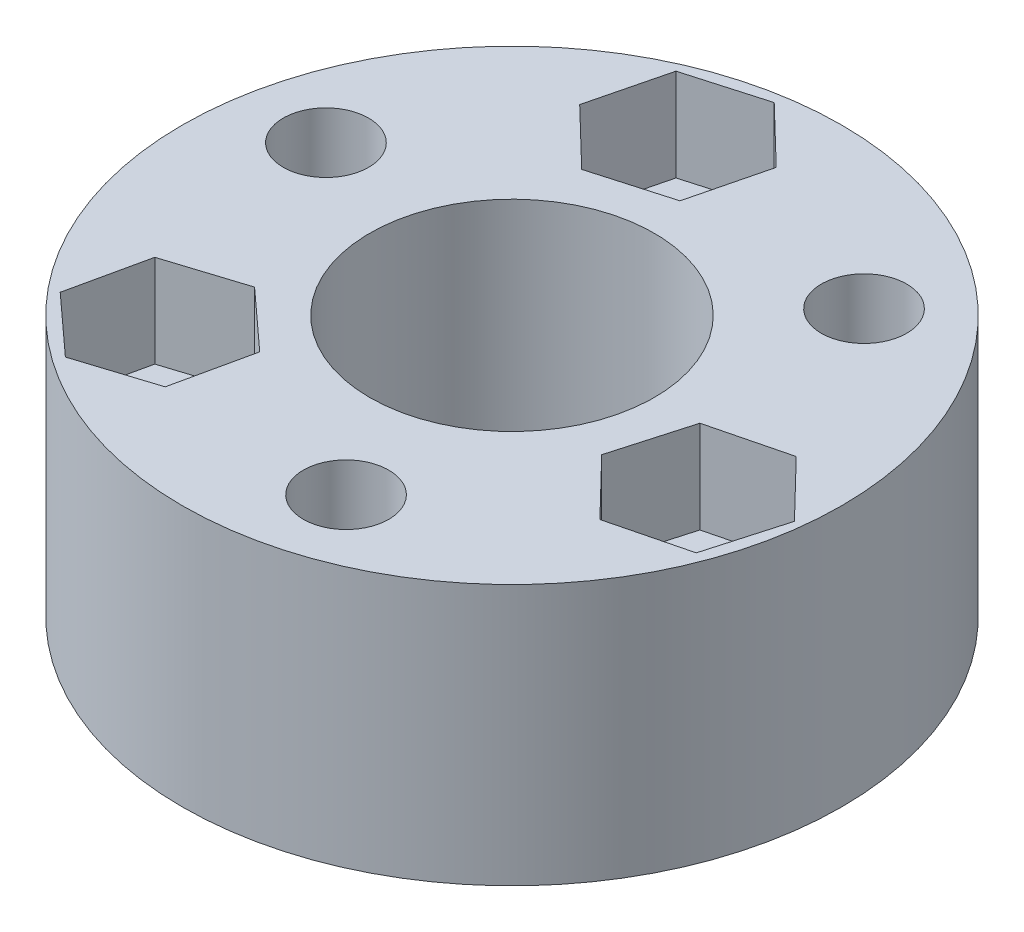
ISO-10303-21;
HEADER;
FILE_DESCRIPTION(('STEP AP214'),'2;1');
FILE_NAME('part.step','',(''),(''),'','','');
FILE_SCHEMA(('AUTOMOTIVE_DESIGN { 1 0 10303 214 1 1 1 1 }'));
ENDSEC;
DATA;
#1=APPLICATION_CONTEXT('core data for automotive mechanical design processes');
#2=APPLICATION_PROTOCOL_DEFINITION('international standard','automotive_design',2000,#1);
#3=PRODUCT_CONTEXT('',#1,'mechanical');
#4=PRODUCT('Part','Part','',(#3));
#5=PRODUCT_RELATED_PRODUCT_CATEGORY('part','',(#4));
#6=PRODUCT_DEFINITION_FORMATION('','',#4);
#7=PRODUCT_DEFINITION_CONTEXT('part definition',#1,'design');
#8=PRODUCT_DEFINITION('design','',#6,#7);
#9=PRODUCT_DEFINITION_SHAPE('','',#8);
#10=(LENGTH_UNIT() NAMED_UNIT(*) SI_UNIT(.MILLI.,.METRE.));
#11=(NAMED_UNIT(*) PLANE_ANGLE_UNIT() SI_UNIT($,.RADIAN.));
#12=(NAMED_UNIT(*) SI_UNIT($,.STERADIAN.) SOLID_ANGLE_UNIT());
#13=UNCERTAINTY_MEASURE_WITH_UNIT(LENGTH_MEASURE(1.E-05),#10,'distance_accuracy_value','');
#14=(GEOMETRIC_REPRESENTATION_CONTEXT(3) GLOBAL_UNCERTAINTY_ASSIGNED_CONTEXT((#13)) GLOBAL_UNIT_ASSIGNED_CONTEXT((#10,
#11,#12)) REPRESENTATION_CONTEXT('',''));
#15=CARTESIAN_POINT('',(0.,0.,0.));
#16=DIRECTION('',(0.,0.,1.));
#17=DIRECTION('',(1.,0.,0.));
#18=AXIS2_PLACEMENT_3D('',#15,#16,#17);
#19=CARTESIAN_POINT('',(-3.05051137175429,11.,-10.0471080600737));
#20=DIRECTION('',(0.,-1.,0.));
#21=DIRECTION('',(0.,0.,-1.));
#22=AXIS2_PLACEMENT_3D('',#19,#20,#21);
#23=CYLINDRICAL_SURFACE('',#22,1.8);
#24=CARTESIAN_POINT('',(-3.05051137175429,0.,-10.0471080600737));
#25=DIRECTION('',(0.,1.,0.));
#26=DIRECTION('',(0.,0.,1.));
#27=AXIS2_PLACEMENT_3D('',#24,#25,#26);
#28=CIRCLE('',#27,1.8);
#29=CARTESIAN_POINT('',(-3.05051137175429,0.,-8.24710806007369));
#30=VERTEX_POINT('',#29);
#31=EDGE_CURVE('E331',#30,#30,#28,.T.);
#32=ORIENTED_EDGE('',*,*,#31,.F.);
#33=EDGE_LOOP('',(#32));
#34=FACE_BOUND('',#33,.T.);
#35=CARTESIAN_POINT('',(-3.05051137175429,7.1,-10.0471080600737));
#36=DIRECTION('',(0.,1.,0.));
#37=DIRECTION('',(0.,0.,1.));
#38=AXIS2_PLACEMENT_3D('',#35,#36,#37);
#39=CIRCLE('',#38,1.8);
#40=CARTESIAN_POINT('',(-3.05051137175429,7.1,-8.24710806007369));
#41=VERTEX_POINT('',#40);
#42=EDGE_CURVE('E37',#41,#41,#39,.T.);
#43=ORIENTED_EDGE('',*,*,#42,.T.);
#44=EDGE_LOOP('',(#43));
#45=FACE_BOUND('',#44,.T.);
#46=ADVANCED_FACE('F33',(#34,#45),#23,.F.);
#47=CARTESIAN_POINT('',(10.2263065004685,11.,2.38173368756413));
#48=DIRECTION('',(0.,-1.,0.));
#49=DIRECTION('',(0.,0.,-1.));
#50=AXIS2_PLACEMENT_3D('',#47,#48,#49);
#51=CYLINDRICAL_SURFACE('',#50,1.8);
#52=CARTESIAN_POINT('',(10.2263065004685,0.,2.38173368756413));
#53=DIRECTION('',(0.,1.,0.));
#54=DIRECTION('',(0.,0.,1.));
#55=AXIS2_PLACEMENT_3D('',#52,#53,#54);
#56=CIRCLE('',#55,1.8);
#57=CARTESIAN_POINT('',(10.2263065004685,0.,4.18173368756413));
#58=VERTEX_POINT('',#57);
#59=EDGE_CURVE('E322',#58,#58,#56,.T.);
#60=ORIENTED_EDGE('',*,*,#59,.F.);
#61=EDGE_LOOP('',(#60));
#62=FACE_BOUND('',#61,.T.);
#63=CARTESIAN_POINT('',(10.2263065004685,7.1,2.38173368756413));
#64=DIRECTION('',(0.,1.,0.));
#65=DIRECTION('',(0.,0.,1.));
#66=AXIS2_PLACEMENT_3D('',#63,#64,#65);
#67=CIRCLE('',#66,1.8);
#68=CARTESIAN_POINT('',(10.2263065004685,7.1,4.18173368756413));
#69=VERTEX_POINT('',#68);
#70=EDGE_CURVE('E345',#69,#69,#67,.T.);
#71=ORIENTED_EDGE('',*,*,#70,.T.);
#72=EDGE_LOOP('',(#71));
#73=FACE_BOUND('',#72,.T.);
#74=ADVANCED_FACE('F362',(#62,#73),#51,.F.);
#75=CARTESIAN_POINT('',(-7.17579512871381,11.,7.66537437250944));
#76=DIRECTION('',(0.,-1.,0.));
#77=DIRECTION('',(0.,0.,-1.));
#78=AXIS2_PLACEMENT_3D('',#75,#76,#77);
#79=CYLINDRICAL_SURFACE('',#78,1.8);
#80=CARTESIAN_POINT('',(-7.17579512871381,0.,7.66537437250944));
#81=DIRECTION('',(0.,1.,0.));
#82=DIRECTION('',(0.,0.,1.));
#83=AXIS2_PLACEMENT_3D('',#80,#81,#82);
#84=CIRCLE('',#83,1.8);
#85=CARTESIAN_POINT('',(-7.17579512871381,0.,9.46537437250944));
#86=VERTEX_POINT('',#85);
#87=EDGE_CURVE('E312',#86,#86,#84,.T.);
#88=ORIENTED_EDGE('',*,*,#87,.F.);
#89=EDGE_LOOP('',(#88));
#90=FACE_BOUND('',#89,.T.);
#91=CARTESIAN_POINT('',(-7.17579512871381,7.1,7.66537437250944));
#92=DIRECTION('',(0.,1.,0.));
#93=DIRECTION('',(0.,0.,1.));
#94=AXIS2_PLACEMENT_3D('',#91,#92,#93);
#95=CIRCLE('',#94,1.8);
#96=CARTESIAN_POINT('',(-7.17579512871381,7.1,9.46537437250944));
#97=VERTEX_POINT('',#96);
#98=EDGE_CURVE('E208',#97,#97,#95,.T.);
#99=ORIENTED_EDGE('',*,*,#98,.T.);
#100=EDGE_LOOP('',(#99));
#101=FACE_BOUND('',#100,.T.);
#102=ADVANCED_FACE('F368',(#90,#101),#79,.F.);
#103=CARTESIAN_POINT('',(0.,11.,0.));
#104=DIRECTION('',(0.,1.,0.));
#105=DIRECTION('',(0.,0.,1.));
#106=AXIS2_PLACEMENT_3D('',#103,#104,#105);
#107=PLANE('',#106);
#108=DIRECTION('',(0.719676550427876,0.,0.694309486298605));
#109=VECTOR('',#108,1.);
#110=CARTESIAN_POINT('',(-6.26897468736533,11.,-9.12253939339754));
#111=LINE('',#110,#109);
#112=CARTESIAN_POINT('',(-6.26897468736533,11.,-9.12253939339754));
#113=VERTEX_POINT('',#112);
#114=CARTESIAN_POINT('',(-3.85904307667516,11.,-6.79755273426816));
#115=VERTEX_POINT('',#114);
#116=EDGE_CURVE('E50',#113,#115,#111,.T.);
#117=ORIENTED_EDGE('',*,*,#116,.F.);
#118=DIRECTION('',(-0.241451378009179,0.,0.970412918327796));
#119=VECTOR('',#118,1.);
#120=CARTESIAN_POINT('',(-5.46044298244446,11.,-12.3720947192031));
#121=LINE('',#120,#119);
#122=CARTESIAN_POINT('',(-5.46044298244446,11.,-12.3720947192031));
#123=VERTEX_POINT('',#122);
#124=EDGE_CURVE('E181',#123,#113,#121,.T.);
#125=ORIENTED_EDGE('',*,*,#124,.F.);
#126=DIRECTION('',(-0.961127928437054,0.,0.27610343202919));
#127=VECTOR('',#126,1.);
#128=CARTESIAN_POINT('',(-2.24197966683342,11.,-13.2966633858792));
#129=LINE('',#128,#127);
#130=CARTESIAN_POINT('',(-2.24197966683342,11.,-13.2966633858792));
#131=VERTEX_POINT('',#130);
#132=EDGE_CURVE('E184',#131,#123,#129,.T.);
#133=ORIENTED_EDGE('',*,*,#132,.F.);
#134=DIRECTION('',(-0.719676550427876,0.,-0.694309486298605));
#135=VECTOR('',#134,1.);
#136=CARTESIAN_POINT('',(0.167951943856751,11.,-10.9716767267498));
#137=LINE('',#136,#135);
#138=CARTESIAN_POINT('',(0.167951943856751,11.,-10.9716767267498));
#139=VERTEX_POINT('',#138);
#140=EDGE_CURVE('E201',#139,#131,#137,.T.);
#141=ORIENTED_EDGE('',*,*,#140,.F.);
#142=DIRECTION('',(0.241451378009178,0.,-0.970412918327796));
#143=VECTOR('',#142,1.);
#144=CARTESIAN_POINT('',(-0.640579761064119,11.,-7.72212140094431));
#145=LINE('',#144,#143);
#146=CARTESIAN_POINT('',(-0.640579761064119,11.,-7.72212140094431));
#147=VERTEX_POINT('',#146);
#148=EDGE_CURVE('E198',#147,#139,#145,.T.);
#149=ORIENTED_EDGE('',*,*,#148,.F.);
#150=DIRECTION('',(0.961127928437054,0.,-0.27610343202919));
#151=VECTOR('',#150,1.);
#152=CARTESIAN_POINT('',(-3.85904307667516,11.,-6.79755273426816));
#153=LINE('',#152,#151);
#154=EDGE_CURVE('E195',#115,#147,#153,.T.);
#155=ORIENTED_EDGE('',*,*,#154,.F.);
#156=EDGE_LOOP('',(#117,#125,#133,#141,#149,#155));
#157=FACE_BOUND('',#156,.T.);
#158=DIRECTION('',(0.969990076691495,0.,-0.243144506662249));
#159=VECTOR('',#158,1.);
#160=CARTESIAN_POINT('',(9.30735587731066,11.,5.6018055944524));
#161=LINE('',#160,#159);
#162=CARTESIAN_POINT('',(9.30735587731066,11.,5.6018055944524));
#163=VERTEX_POINT('',#162);
#164=CARTESIAN_POINT('',(12.5554952622674,11.,4.78760422548652));
#165=VERTEX_POINT('',#164);
#166=EDGE_CURVE('E58',#163,#165,#161,.T.);
#167=ORIENTED_EDGE('',*,*,#166,.F.);
#168=DIRECTION('',(0.69556435790589,0.,0.718463794502526));
#169=VECTOR('',#168,1.);
#170=CARTESIAN_POINT('',(6.97816711551175,11.,3.19593505653001));
#171=LINE('',#170,#169);
#172=CARTESIAN_POINT('',(6.97816711551175,11.,3.19593505653001));
#173=VERTEX_POINT('',#172);
#174=EDGE_CURVE('E220',#173,#163,#171,.T.);
#175=ORIENTED_EDGE('',*,*,#174,.F.);
#176=DIRECTION('',(-0.274425718785605,0.,0.961608301164775));
#177=VECTOR('',#176,1.);
#178=CARTESIAN_POINT('',(7.89711773866962,11.,-0.0241368503582643));
#179=LINE('',#178,#177);
#180=CARTESIAN_POINT('',(7.89711773866962,11.,-0.0241368503582643));
#181=VERTEX_POINT('',#180);
#182=EDGE_CURVE('E247',#181,#173,#179,.T.);
#183=ORIENTED_EDGE('',*,*,#182,.F.);
#184=DIRECTION('',(-0.969990076691495,0.,0.243144506662249));
#185=VECTOR('',#184,1.);
#186=CARTESIAN_POINT('',(11.1452571236264,11.,-0.838338219324149));
#187=LINE('',#186,#185);
#188=CARTESIAN_POINT('',(11.1452571236264,11.,-0.838338219324149));
#189=VERTEX_POINT('',#188);
#190=EDGE_CURVE('E244',#189,#181,#187,.T.);
#191=ORIENTED_EDGE('',*,*,#190,.F.);
#192=DIRECTION('',(-0.69556435790589,0.,-0.718463794502526));
#193=VECTOR('',#192,1.);
#194=CARTESIAN_POINT('',(13.4744458854253,11.,1.56753231859824));
#195=LINE('',#194,#193);
#196=CARTESIAN_POINT('',(13.4744458854253,11.,1.56753231859824));
#197=VERTEX_POINT('',#196);
#198=EDGE_CURVE('E241',#197,#189,#195,.T.);
#199=ORIENTED_EDGE('',*,*,#198,.F.);
#200=DIRECTION('',(0.274425718785604,0.,-0.961608301164775));
#201=VECTOR('',#200,1.);
#202=CARTESIAN_POINT('',(12.5554952622674,11.,4.78760422548652));
#203=LINE('',#202,#201);
#204=EDGE_CURVE('E237',#165,#197,#203,.T.);
#205=ORIENTED_EDGE('',*,*,#204,.F.);
#206=EDGE_LOOP('',(#167,#175,#183,#191,#199,#205));
#207=FACE_BOUND('',#206,.T.);
#208=DIRECTION('',(0.95296035721692,0.,-0.303094964611753));
#209=VECTOR('',#208,1.);
#210=CARTESIAN_POINT('',(-7.8923762957618,11.,10.9364360907235));
#211=LINE('',#210,#209);
#212=CARTESIAN_POINT('',(-7.8923762957618,11.,10.9364360907235));
#213=VERTEX_POINT('',#212);
#214=CARTESIAN_POINT('',(-4.70126316691766,11.,9.92148272615353));
#215=VERTEX_POINT('',#214);
#216=EDGE_CURVE('E282',#213,#215,#211,.T.);
#217=ORIENTED_EDGE('',*,*,#216,.F.);
#218=DIRECTION('',(0.738968117721384,0.,0.673740395843469));
#219=VECTOR('',#218,1.);
#220=CARTESIAN_POINT('',(-10.366908257558,11.,8.68032773707942));
#221=LINE('',#220,#219);
#222=CARTESIAN_POINT('',(-10.366908257558,11.,8.68032773707942));
#223=VERTEX_POINT('',#222);
#224=EDGE_CURVE('E266',#223,#213,#221,.T.);
#225=ORIENTED_EDGE('',*,*,#224,.F.);
#226=DIRECTION('',(-0.213992239495536,0.,0.976835360455223));
#227=VECTOR('',#226,1.);
#228=CARTESIAN_POINT('',(-9.65032709050997,11.,5.40926601886536));
#229=LINE('',#228,#227);
#230=CARTESIAN_POINT('',(-9.65032709050997,11.,5.40926601886536));
#231=VERTEX_POINT('',#230);
#232=EDGE_CURVE('E293',#231,#223,#229,.T.);
#233=ORIENTED_EDGE('',*,*,#232,.F.);
#234=DIRECTION('',(-0.95296035721692,0.,0.303094964611754));
#235=VECTOR('',#234,1.);
#236=CARTESIAN_POINT('',(-6.45921396166583,11.,4.39431265429539));
#237=LINE('',#236,#235);
#238=CARTESIAN_POINT('',(-6.45921396166583,11.,4.39431265429539));
#239=VERTEX_POINT('',#238);
#240=EDGE_CURVE('E290',#239,#231,#237,.T.);
#241=ORIENTED_EDGE('',*,*,#240,.F.);
#242=DIRECTION('',(-0.738968117721384,0.,-0.673740395843469));
#243=VECTOR('',#242,1.);
#244=CARTESIAN_POINT('',(-3.98468199986967,11.,6.65042100793947));
#245=LINE('',#244,#243);
#246=CARTESIAN_POINT('',(-3.98468199986967,11.,6.65042100793947));
#247=VERTEX_POINT('',#246);
#248=EDGE_CURVE('E287',#247,#239,#245,.T.);
#249=ORIENTED_EDGE('',*,*,#248,.F.);
#250=DIRECTION('',(0.213992239495537,0.,-0.976835360455223));
#251=VECTOR('',#250,1.);
#252=CARTESIAN_POINT('',(-4.70126316691766,11.,9.92148272615353));
#253=LINE('',#252,#251);
#254=EDGE_CURVE('E284',#215,#247,#253,.T.);
#255=ORIENTED_EDGE('',*,*,#254,.F.);
#256=EDGE_LOOP('',(#217,#225,#233,#241,#249,#255));
#257=FACE_BOUND('',#256,.T.);
#258=CARTESIAN_POINT('',(0.,11.,0.));
#259=DIRECTION('',(0.,1.,0.));
#260=DIRECTION('',(0.,0.,1.));
#261=AXIS2_PLACEMENT_3D('',#258,#259,#260);
#262=CIRCLE('',#261,13.9);
#263=CARTESIAN_POINT('',(0.,11.,13.9));
#264=VERTEX_POINT('',#263);
#265=EDGE_CURVE('E11',#264,#264,#262,.T.);
#266=ORIENTED_EDGE('',*,*,#265,.T.);
#267=EDGE_LOOP('',(#266));
#268=FACE_BOUND('',#267,.T.);
#269=CARTESIAN_POINT('',(0.,11.,0.));
#270=DIRECTION('',(0.,1.,0.));
#271=DIRECTION('',(0.,0.,1.));
#272=AXIS2_PLACEMENT_3D('',#269,#270,#271);
#273=CIRCLE('',#272,6.);
#274=CARTESIAN_POINT('',(0.,11.,6.));
#275=VERTEX_POINT('',#274);
#276=EDGE_CURVE('E337',#275,#275,#273,.T.);
#277=ORIENTED_EDGE('',*,*,#276,.F.);
#278=EDGE_LOOP('',(#277));
#279=FACE_BOUND('',#278,.T.);
#280=CARTESIAN_POINT('',(7.17579512871409,11.,-7.66537437250952));
#281=DIRECTION('',(0.,1.,0.));
#282=DIRECTION('',(0.,0.,1.));
#283=AXIS2_PLACEMENT_3D('',#280,#281,#282);
#284=CIRCLE('',#283,1.8);
#285=CARTESIAN_POINT('',(7.17579512871409,11.,-5.86537437250953));
#286=VERTEX_POINT('',#285);
#287=EDGE_CURVE('E328',#286,#286,#284,.T.);
#288=ORIENTED_EDGE('',*,*,#287,.F.);
#289=EDGE_LOOP('',(#288));
#290=FACE_BOUND('',#289,.T.);
#291=CARTESIAN_POINT('',(3.05051137175458,11.,10.0471080600736));
#292=DIRECTION('',(0.,1.,0.));
#293=DIRECTION('',(0.,0.,1.));
#294=AXIS2_PLACEMENT_3D('',#291,#292,#293);
#295=CIRCLE('',#294,1.8);
#296=CARTESIAN_POINT('',(3.05051137175458,11.,11.8471080600736));
#297=VERTEX_POINT('',#296);
#298=EDGE_CURVE('E319',#297,#297,#295,.T.);
#299=ORIENTED_EDGE('',*,*,#298,.F.);
#300=EDGE_LOOP('',(#299));
#301=FACE_BOUND('',#300,.T.);
#302=CARTESIAN_POINT('',(-10.2263065004682,11.,-2.3817336875642));
#303=DIRECTION('',(0.,1.,0.));
#304=DIRECTION('',(0.,0.,1.));
#305=AXIS2_PLACEMENT_3D('',#302,#303,#304);
#306=CIRCLE('',#305,1.8);
#307=CARTESIAN_POINT('',(-10.2263065004682,11.,-0.581733687564204));
#308=VERTEX_POINT('',#307);
#309=EDGE_CURVE('E309',#308,#308,#306,.T.);
#310=ORIENTED_EDGE('',*,*,#309,.F.);
#311=EDGE_LOOP('',(#310));
#312=FACE_BOUND('',#311,.T.);
#313=ADVANCED_FACE('F379',(#157,#207,#257,#268,#279,#290,#301,#312),#107,.T.);
#314=CARTESIAN_POINT('',(0.,0.,0.));
#315=DIRECTION('',(0.,1.,0.));
#316=DIRECTION('',(0.,0.,1.));
#317=AXIS2_PLACEMENT_3D('',#314,#315,#316);
#318=PLANE('',#317);
#319=CARTESIAN_POINT('',(0.,0.,0.));
#320=DIRECTION('',(0.,1.,0.));
#321=DIRECTION('',(0.,0.,1.));
#322=AXIS2_PLACEMENT_3D('',#319,#320,#321);
#323=CIRCLE('',#322,13.9);
#324=CARTESIAN_POINT('',(0.,0.,13.9));
#325=VERTEX_POINT('',#324);
#326=EDGE_CURVE('E42',#325,#325,#323,.T.);
#327=ORIENTED_EDGE('',*,*,#326,.F.);
#328=EDGE_LOOP('',(#327));
#329=FACE_BOUND('',#328,.T.);
#330=CARTESIAN_POINT('',(0.,0.,0.));
#331=DIRECTION('',(0.,1.,0.));
#332=DIRECTION('',(0.,0.,1.));
#333=AXIS2_PLACEMENT_3D('',#330,#331,#332);
#334=CIRCLE('',#333,6.);
#335=CARTESIAN_POINT('',(0.,0.,6.));
#336=VERTEX_POINT('',#335);
#337=EDGE_CURVE('E336',#336,#336,#334,.T.);
#338=ORIENTED_EDGE('',*,*,#337,.T.);
#339=EDGE_LOOP('',(#338));
#340=FACE_BOUND('',#339,.T.);
#341=ORIENTED_EDGE('',*,*,#31,.T.);
#342=EDGE_LOOP('',(#341));
#343=FACE_BOUND('',#342,.T.);
#344=CARTESIAN_POINT('',(7.17579512871409,0.,-7.66537437250952));
#345=DIRECTION('',(0.,1.,0.));
#346=DIRECTION('',(0.,0.,1.));
#347=AXIS2_PLACEMENT_3D('',#344,#345,#346);
#348=CIRCLE('',#347,1.8);
#349=CARTESIAN_POINT('',(7.17579512871409,0.,-5.86537437250953));
#350=VERTEX_POINT('',#349);
#351=EDGE_CURVE('E327',#350,#350,#348,.T.);
#352=ORIENTED_EDGE('',*,*,#351,.T.);
#353=EDGE_LOOP('',(#352));
#354=FACE_BOUND('',#353,.T.);
#355=ORIENTED_EDGE('',*,*,#59,.T.);
#356=EDGE_LOOP('',(#355));
#357=FACE_BOUND('',#356,.T.);
#358=CARTESIAN_POINT('',(3.05051137175458,0.,10.0471080600736));
#359=DIRECTION('',(0.,1.,0.));
#360=DIRECTION('',(0.,0.,1.));
#361=AXIS2_PLACEMENT_3D('',#358,#359,#360);
#362=CIRCLE('',#361,1.8);
#363=CARTESIAN_POINT('',(3.05051137175458,0.,11.8471080600736));
#364=VERTEX_POINT('',#363);
#365=EDGE_CURVE('E318',#364,#364,#362,.T.);
#366=ORIENTED_EDGE('',*,*,#365,.T.);
#367=EDGE_LOOP('',(#366));
#368=FACE_BOUND('',#367,.T.);
#369=ORIENTED_EDGE('',*,*,#87,.T.);
#370=EDGE_LOOP('',(#369));
#371=FACE_BOUND('',#370,.T.);
#372=CARTESIAN_POINT('',(-10.2263065004682,0.,-2.3817336875642));
#373=DIRECTION('',(0.,1.,0.));
#374=DIRECTION('',(0.,0.,1.));
#375=AXIS2_PLACEMENT_3D('',#372,#373,#374);
#376=CIRCLE('',#375,1.8);
#377=CARTESIAN_POINT('',(-10.2263065004682,0.,-0.581733687564204));
#378=VERTEX_POINT('',#377);
#379=EDGE_CURVE('E313',#378,#378,#376,.T.);
#380=ORIENTED_EDGE('',*,*,#379,.T.);
#381=EDGE_LOOP('',(#380));
#382=FACE_BOUND('',#381,.T.);
#383=ADVANCED_FACE('F381',(#329,#340,#343,#354,#357,#368,#371,#382),#318,.F.);
#384=CARTESIAN_POINT('',(0.,11.,0.));
#385=DIRECTION('',(0.,-1.,0.));
#386=DIRECTION('',(0.,0.,-1.));
#387=AXIS2_PLACEMENT_3D('',#384,#385,#386);
#388=CYLINDRICAL_SURFACE('',#387,13.9);
#389=ORIENTED_EDGE('',*,*,#265,.F.);
#390=EDGE_LOOP('',(#389));
#391=FACE_BOUND('',#390,.T.);
#392=ORIENTED_EDGE('',*,*,#326,.T.);
#393=EDGE_LOOP('',(#392));
#394=FACE_BOUND('',#393,.T.);
#395=ADVANCED_FACE('F35',(#391,#394),#388,.T.);
#396=CARTESIAN_POINT('',(0.,11.,0.));
#397=DIRECTION('',(0.,-1.,0.));
#398=DIRECTION('',(0.,0.,-1.));
#399=AXIS2_PLACEMENT_3D('',#396,#397,#398);
#400=CYLINDRICAL_SURFACE('',#399,6.);
#401=ORIENTED_EDGE('',*,*,#276,.T.);
#402=EDGE_LOOP('',(#401));
#403=FACE_BOUND('',#402,.T.);
#404=ORIENTED_EDGE('',*,*,#337,.F.);
#405=EDGE_LOOP('',(#404));
#406=FACE_BOUND('',#405,.T.);
#407=ADVANCED_FACE('F375',(#403,#406),#400,.F.);
#408=CARTESIAN_POINT('',(7.17579512871409,11.,-7.66537437250952));
#409=DIRECTION('',(0.,-1.,0.));
#410=DIRECTION('',(0.,0.,-1.));
#411=AXIS2_PLACEMENT_3D('',#408,#409,#410);
#412=CYLINDRICAL_SURFACE('',#411,1.8);
#413=ORIENTED_EDGE('',*,*,#287,.T.);
#414=EDGE_LOOP('',(#413));
#415=FACE_BOUND('',#414,.T.);
#416=ORIENTED_EDGE('',*,*,#351,.F.);
#417=EDGE_LOOP('',(#416));
#418=FACE_BOUND('',#417,.T.);
#419=ADVANCED_FACE('F374',(#415,#418),#412,.F.);
#420=CARTESIAN_POINT('',(3.05051137175458,11.,10.0471080600736));
#421=DIRECTION('',(0.,-1.,0.));
#422=DIRECTION('',(0.,0.,-1.));
#423=AXIS2_PLACEMENT_3D('',#420,#421,#422);
#424=CYLINDRICAL_SURFACE('',#423,1.8);
#425=ORIENTED_EDGE('',*,*,#298,.T.);
#426=EDGE_LOOP('',(#425));
#427=FACE_BOUND('',#426,.T.);
#428=ORIENTED_EDGE('',*,*,#365,.F.);
#429=EDGE_LOOP('',(#428));
#430=FACE_BOUND('',#429,.T.);
#431=ADVANCED_FACE('F407',(#427,#430),#424,.F.);
#432=CARTESIAN_POINT('',(-10.2263065004682,11.,-2.3817336875642));
#433=DIRECTION('',(0.,-1.,0.));
#434=DIRECTION('',(0.,0.,-1.));
#435=AXIS2_PLACEMENT_3D('',#432,#433,#434);
#436=CYLINDRICAL_SURFACE('',#435,1.8);
#437=ORIENTED_EDGE('',*,*,#309,.T.);
#438=EDGE_LOOP('',(#437));
#439=FACE_BOUND('',#438,.T.);
#440=ORIENTED_EDGE('',*,*,#379,.F.);
#441=EDGE_LOOP('',(#440));
#442=FACE_BOUND('',#441,.T.);
#443=ADVANCED_FACE('F404',(#439,#442),#436,.F.);
#444=CARTESIAN_POINT('',(-7.8923762957618,7.1,10.9364360907235));
#445=DIRECTION('',(0.303094964611753,0.,0.95296035721692));
#446=DIRECTION('',(0.95296035721692,0.,-0.303094964611753));
#447=AXIS2_PLACEMENT_3D('',#444,#445,#446);
#448=PLANE('',#447);
#449=ORIENTED_EDGE('',*,*,#216,.T.);
#450=DIRECTION('',(0.,1.,0.));
#451=VECTOR('',#450,1.);
#452=CARTESIAN_POINT('',(-4.70126316691766,7.1,9.92148272615353));
#453=LINE('',#452,#451);
#454=CARTESIAN_POINT('',(-4.70126316691766,7.1,9.92148272615353));
#455=VERTEX_POINT('',#454);
#456=EDGE_CURVE('E281',#455,#215,#453,.T.);
#457=ORIENTED_EDGE('',*,*,#456,.F.);
#458=DIRECTION('',(0.95296035721692,0.,-0.303094964611753));
#459=VECTOR('',#458,1.);
#460=CARTESIAN_POINT('',(-7.8923762957618,7.1,10.9364360907235));
#461=LINE('',#460,#459);
#462=CARTESIAN_POINT('',(-7.8923762957618,7.1,10.9364360907235));
#463=VERTEX_POINT('',#462);
#464=EDGE_CURVE('E262',#463,#455,#461,.T.);
#465=ORIENTED_EDGE('',*,*,#464,.F.);
#466=DIRECTION('',(0.,1.,0.));
#467=VECTOR('',#466,1.);
#468=CARTESIAN_POINT('',(-7.8923762957618,7.1,10.9364360907235));
#469=LINE('',#468,#467);
#470=EDGE_CURVE('E238',#463,#213,#469,.T.);
#471=ORIENTED_EDGE('',*,*,#470,.T.);
#472=EDGE_LOOP('',(#449,#457,#465,#471));
#473=FACE_BOUND('',#472,.T.);
#474=ADVANCED_FACE('F406',(#473),#448,.F.);
#475=CARTESIAN_POINT('',(-10.366908257558,7.1,8.68032773707942));
#476=DIRECTION('',(-0.673740395843469,0.,0.738968117721384));
#477=DIRECTION('',(0.738968117721384,0.,0.673740395843469));
#478=AXIS2_PLACEMENT_3D('',#475,#476,#477);
#479=PLANE('',#478);
#480=ORIENTED_EDGE('',*,*,#224,.T.);
#481=ORIENTED_EDGE('',*,*,#470,.F.);
#482=DIRECTION('',(0.738968117721384,0.,0.673740395843469));
#483=VECTOR('',#482,1.);
#484=CARTESIAN_POINT('',(-10.366908257558,7.1,8.68032773707942));
#485=LINE('',#484,#483);
#486=CARTESIAN_POINT('',(-10.366908257558,7.1,8.68032773707942));
#487=VERTEX_POINT('',#486);
#488=EDGE_CURVE('E278',#487,#463,#485,.T.);
#489=ORIENTED_EDGE('',*,*,#488,.F.);
#490=DIRECTION('',(0.,1.,0.));
#491=VECTOR('',#490,1.);
#492=CARTESIAN_POINT('',(-10.366908257558,7.1,8.68032773707942));
#493=LINE('',#492,#491);
#494=EDGE_CURVE('E299',#487,#223,#493,.T.);
#495=ORIENTED_EDGE('',*,*,#494,.T.);
#496=EDGE_LOOP('',(#480,#481,#489,#495));
#497=FACE_BOUND('',#496,.T.);
#498=ADVANCED_FACE('F414',(#497),#479,.F.);
#499=CARTESIAN_POINT('',(-9.65032709050997,7.1,5.40926601886536));
#500=DIRECTION('',(-0.976835360455223,0.,-0.213992239495536));
#501=DIRECTION('',(-0.213992239495536,0.,0.976835360455223));
#502=AXIS2_PLACEMENT_3D('',#499,#500,#501);
#503=PLANE('',#502);
#504=ORIENTED_EDGE('',*,*,#232,.T.);
#505=ORIENTED_EDGE('',*,*,#494,.F.);
#506=DIRECTION('',(-0.213992239495536,0.,0.976835360455223));
#507=VECTOR('',#506,1.);
#508=CARTESIAN_POINT('',(-9.65032709050997,7.1,5.40926601886536));
#509=LINE('',#508,#507);
#510=CARTESIAN_POINT('',(-9.65032709050997,7.1,5.40926601886536));
#511=VERTEX_POINT('',#510);
#512=EDGE_CURVE('E275',#511,#487,#509,.T.);
#513=ORIENTED_EDGE('',*,*,#512,.F.);
#514=DIRECTION('',(0.,1.,0.));
#515=VECTOR('',#514,1.);
#516=CARTESIAN_POINT('',(-9.65032709050997,7.1,5.40926601886536));
#517=LINE('',#516,#515);
#518=EDGE_CURVE('E301',#511,#231,#517,.T.);
#519=ORIENTED_EDGE('',*,*,#518,.T.);
#520=EDGE_LOOP('',(#504,#505,#513,#519));
#521=FACE_BOUND('',#520,.T.);
#522=ADVANCED_FACE('F451',(#521),#503,.F.);
#523=CARTESIAN_POINT('',(-6.45921396166583,7.1,4.39431265429539));
#524=DIRECTION('',(-0.303094964611754,0.,-0.95296035721692));
#525=DIRECTION('',(-0.95296035721692,0.,0.303094964611754));
#526=AXIS2_PLACEMENT_3D('',#523,#524,#525);
#527=PLANE('',#526);
#528=ORIENTED_EDGE('',*,*,#240,.T.);
#529=ORIENTED_EDGE('',*,*,#518,.F.);
#530=DIRECTION('',(-0.95296035721692,0.,0.303094964611754));
#531=VECTOR('',#530,1.);
#532=CARTESIAN_POINT('',(-6.45921396166583,7.1,4.39431265429539));
#533=LINE('',#532,#531);
#534=CARTESIAN_POINT('',(-6.45921396166583,7.1,4.39431265429539));
#535=VERTEX_POINT('',#534);
#536=EDGE_CURVE('E272',#535,#511,#533,.T.);
#537=ORIENTED_EDGE('',*,*,#536,.F.);
#538=DIRECTION('',(0.,1.,0.));
#539=VECTOR('',#538,1.);
#540=CARTESIAN_POINT('',(-6.45921396166583,7.1,4.39431265429539));
#541=LINE('',#540,#539);
#542=EDGE_CURVE('E303',#535,#239,#541,.T.);
#543=ORIENTED_EDGE('',*,*,#542,.T.);
#544=EDGE_LOOP('',(#528,#529,#537,#543));
#545=FACE_BOUND('',#544,.T.);
#546=ADVANCED_FACE('F447',(#545),#527,.F.);
#547=CARTESIAN_POINT('',(-3.98468199986967,7.1,6.65042100793947));
#548=DIRECTION('',(0.673740395843469,0.,-0.738968117721384));
#549=DIRECTION('',(-0.738968117721384,0.,-0.673740395843469));
#550=AXIS2_PLACEMENT_3D('',#547,#548,#549);
#551=PLANE('',#550);
#552=ORIENTED_EDGE('',*,*,#248,.T.);
#553=ORIENTED_EDGE('',*,*,#542,.F.);
#554=DIRECTION('',(-0.738968117721384,0.,-0.673740395843469));
#555=VECTOR('',#554,1.);
#556=CARTESIAN_POINT('',(-3.98468199986967,7.1,6.65042100793947));
#557=LINE('',#556,#555);
#558=CARTESIAN_POINT('',(-3.98468199986967,7.1,6.65042100793947));
#559=VERTEX_POINT('',#558);
#560=EDGE_CURVE('E269',#559,#535,#557,.T.);
#561=ORIENTED_EDGE('',*,*,#560,.F.);
#562=DIRECTION('',(0.,1.,0.));
#563=VECTOR('',#562,1.);
#564=CARTESIAN_POINT('',(-3.98468199986967,7.1,6.65042100793947));
#565=LINE('',#564,#563);
#566=EDGE_CURVE('E305',#559,#247,#565,.T.);
#567=ORIENTED_EDGE('',*,*,#566,.T.);
#568=EDGE_LOOP('',(#552,#553,#561,#567));
#569=FACE_BOUND('',#568,.T.);
#570=ADVANCED_FACE('F443',(#569),#551,.F.);
#571=CARTESIAN_POINT('',(-4.70126316691766,7.1,9.92148272615353));
#572=DIRECTION('',(0.976835360455223,0.,0.213992239495537));
#573=DIRECTION('',(0.213992239495537,0.,-0.976835360455223));
#574=AXIS2_PLACEMENT_3D('',#571,#572,#573);
#575=PLANE('',#574);
#576=ORIENTED_EDGE('',*,*,#254,.T.);
#577=ORIENTED_EDGE('',*,*,#566,.F.);
#578=DIRECTION('',(0.213992239495537,0.,-0.976835360455223));
#579=VECTOR('',#578,1.);
#580=CARTESIAN_POINT('',(-4.70126316691766,7.1,9.92148272615353));
#581=LINE('',#580,#579);
#582=EDGE_CURVE('E265',#455,#559,#581,.T.);
#583=ORIENTED_EDGE('',*,*,#582,.F.);
#584=ORIENTED_EDGE('',*,*,#456,.T.);
#585=EDGE_LOOP('',(#576,#577,#583,#584));
#586=FACE_BOUND('',#585,.T.);
#587=ADVANCED_FACE('F432',(#586),#575,.F.);
#588=CARTESIAN_POINT('',(0.,7.1,0.));
#589=DIRECTION('',(0.,1.,0.));
#590=DIRECTION('',(0.,0.,1.));
#591=AXIS2_PLACEMENT_3D('',#588,#589,#590);
#592=PLANE('',#591);
#593=ORIENTED_EDGE('',*,*,#98,.F.);
#594=EDGE_LOOP('',(#593));
#595=FACE_BOUND('',#594,.T.);
#596=ORIENTED_EDGE('',*,*,#464,.T.);
#597=ORIENTED_EDGE('',*,*,#582,.T.);
#598=ORIENTED_EDGE('',*,*,#560,.T.);
#599=ORIENTED_EDGE('',*,*,#536,.T.);
#600=ORIENTED_EDGE('',*,*,#512,.T.);
#601=ORIENTED_EDGE('',*,*,#488,.T.);
#602=EDGE_LOOP('',(#596,#597,#598,#599,#600,#601));
#603=FACE_BOUND('',#602,.T.);
#604=ADVANCED_FACE('F428',(#595,#603),#592,.T.);
#605=CARTESIAN_POINT('',(9.30735587731066,7.1,5.6018055944524));
#606=DIRECTION('',(0.243144506662249,0.,0.969990076691495));
#607=DIRECTION('',(0.969990076691495,0.,-0.243144506662249));
#608=AXIS2_PLACEMENT_3D('',#605,#606,#607);
#609=PLANE('',#608);
#610=ORIENTED_EDGE('',*,*,#166,.T.);
#611=DIRECTION('',(0.,1.,0.));
#612=VECTOR('',#611,1.);
#613=CARTESIAN_POINT('',(12.5554952622674,7.1,4.78760422548652));
#614=LINE('',#613,#612);
#615=CARTESIAN_POINT('',(12.5554952622674,7.1,4.78760422548652));
#616=VERTEX_POINT('',#615);
#617=EDGE_CURVE('E235',#616,#165,#614,.T.);
#618=ORIENTED_EDGE('',*,*,#617,.F.);
#619=DIRECTION('',(0.969990076691495,0.,-0.243144506662249));
#620=VECTOR('',#619,1.);
#621=CARTESIAN_POINT('',(9.30735587731066,7.1,5.6018055944524));
#622=LINE('',#621,#620);
#623=CARTESIAN_POINT('',(9.30735587731066,7.1,5.6018055944524));
#624=VERTEX_POINT('',#623);
#625=EDGE_CURVE('E216',#624,#616,#622,.T.);
#626=ORIENTED_EDGE('',*,*,#625,.F.);
#627=DIRECTION('',(0.,1.,0.));
#628=VECTOR('',#627,1.);
#629=CARTESIAN_POINT('',(9.30735587731066,7.1,5.6018055944524));
#630=LINE('',#629,#628);
#631=EDGE_CURVE('E196',#624,#163,#630,.T.);
#632=ORIENTED_EDGE('',*,*,#631,.T.);
#633=EDGE_LOOP('',(#610,#618,#626,#632));
#634=FACE_BOUND('',#633,.T.);
#635=ADVANCED_FACE('F431',(#634),#609,.F.);
#636=CARTESIAN_POINT('',(6.97816711551175,7.1,3.19593505653001));
#637=DIRECTION('',(-0.718463794502526,0.,0.69556435790589));
#638=DIRECTION('',(0.69556435790589,0.,0.718463794502526));
#639=AXIS2_PLACEMENT_3D('',#636,#637,#638);
#640=PLANE('',#639);
#641=ORIENTED_EDGE('',*,*,#174,.T.);
#642=ORIENTED_EDGE('',*,*,#631,.F.);
#643=DIRECTION('',(0.69556435790589,0.,0.718463794502526));
#644=VECTOR('',#643,1.);
#645=CARTESIAN_POINT('',(6.97816711551175,7.1,3.19593505653001));
#646=LINE('',#645,#644);
#647=CARTESIAN_POINT('',(6.97816711551175,7.1,3.19593505653001));
#648=VERTEX_POINT('',#647);
#649=EDGE_CURVE('E232',#648,#624,#646,.T.);
#650=ORIENTED_EDGE('',*,*,#649,.F.);
#651=DIRECTION('',(0.,1.,0.));
#652=VECTOR('',#651,1.);
#653=CARTESIAN_POINT('',(6.97816711551175,7.1,3.19593505653001));
#654=LINE('',#653,#652);
#655=EDGE_CURVE('E253',#648,#173,#654,.T.);
#656=ORIENTED_EDGE('',*,*,#655,.T.);
#657=EDGE_LOOP('',(#641,#642,#650,#656));
#658=FACE_BOUND('',#657,.T.);
#659=ADVANCED_FACE('F562',(#658),#640,.F.);
#660=CARTESIAN_POINT('',(7.89711773866962,7.1,-0.0241368503582643));
#661=DIRECTION('',(-0.961608301164775,0.,-0.274425718785605));
#662=DIRECTION('',(-0.274425718785605,0.,0.961608301164775));
#663=AXIS2_PLACEMENT_3D('',#660,#661,#662);
#664=PLANE('',#663);
#665=ORIENTED_EDGE('',*,*,#182,.T.);
#666=ORIENTED_EDGE('',*,*,#655,.F.);
#667=DIRECTION('',(-0.274425718785605,0.,0.961608301164775));
#668=VECTOR('',#667,1.);
#669=CARTESIAN_POINT('',(7.89711773866962,7.1,-0.0241368503582643));
#670=LINE('',#669,#668);
#671=CARTESIAN_POINT('',(7.89711773866962,7.1,-0.0241368503582643));
#672=VERTEX_POINT('',#671);
#673=EDGE_CURVE('E229',#672,#648,#670,.T.);
#674=ORIENTED_EDGE('',*,*,#673,.F.);
#675=DIRECTION('',(0.,1.,0.));
#676=VECTOR('',#675,1.);
#677=CARTESIAN_POINT('',(7.89711773866962,7.1,-0.0241368503582643));
#678=LINE('',#677,#676);
#679=EDGE_CURVE('E255',#672,#181,#678,.T.);
#680=ORIENTED_EDGE('',*,*,#679,.T.);
#681=EDGE_LOOP('',(#665,#666,#674,#680));
#682=FACE_BOUND('',#681,.T.);
#683=ADVANCED_FACE('F571',(#682),#664,.F.);
#684=CARTESIAN_POINT('',(11.1452571236264,7.1,-0.838338219324149));
#685=DIRECTION('',(-0.243144506662249,0.,-0.969990076691495));
#686=DIRECTION('',(-0.969990076691495,0.,0.243144506662249));
#687=AXIS2_PLACEMENT_3D('',#684,#685,#686);
#688=PLANE('',#687);
#689=ORIENTED_EDGE('',*,*,#190,.T.);
#690=ORIENTED_EDGE('',*,*,#679,.F.);
#691=DIRECTION('',(-0.969990076691495,0.,0.243144506662249));
#692=VECTOR('',#691,1.);
#693=CARTESIAN_POINT('',(11.1452571236264,7.1,-0.838338219324149));
#694=LINE('',#693,#692);
#695=CARTESIAN_POINT('',(11.1452571236264,7.1,-0.838338219324149));
#696=VERTEX_POINT('',#695);
#697=EDGE_CURVE('E226',#696,#672,#694,.T.);
#698=ORIENTED_EDGE('',*,*,#697,.F.);
#699=DIRECTION('',(0.,1.,0.));
#700=VECTOR('',#699,1.);
#701=CARTESIAN_POINT('',(11.1452571236264,7.1,-0.838338219324149));
#702=LINE('',#701,#700);
#703=EDGE_CURVE('E257',#696,#189,#702,.T.);
#704=ORIENTED_EDGE('',*,*,#703,.T.);
#705=EDGE_LOOP('',(#689,#690,#698,#704));
#706=FACE_BOUND('',#705,.T.);
#707=ADVANCED_FACE('F581',(#706),#688,.F.);
#708=CARTESIAN_POINT('',(13.4744458854253,7.1,1.56753231859824));
#709=DIRECTION('',(0.718463794502526,0.,-0.69556435790589));
#710=DIRECTION('',(-0.69556435790589,0.,-0.718463794502526));
#711=AXIS2_PLACEMENT_3D('',#708,#709,#710);
#712=PLANE('',#711);
#713=ORIENTED_EDGE('',*,*,#198,.T.);
#714=ORIENTED_EDGE('',*,*,#703,.F.);
#715=DIRECTION('',(-0.69556435790589,0.,-0.718463794502526));
#716=VECTOR('',#715,1.);
#717=CARTESIAN_POINT('',(13.4744458854253,7.1,1.56753231859824));
#718=LINE('',#717,#716);
#719=CARTESIAN_POINT('',(13.4744458854253,7.1,1.56753231859824));
#720=VERTEX_POINT('',#719);
#721=EDGE_CURVE('E223',#720,#696,#718,.T.);
#722=ORIENTED_EDGE('',*,*,#721,.F.);
#723=DIRECTION('',(0.,1.,0.));
#724=VECTOR('',#723,1.);
#725=CARTESIAN_POINT('',(13.4744458854253,7.1,1.56753231859824));
#726=LINE('',#725,#724);
#727=EDGE_CURVE('E259',#720,#197,#726,.T.);
#728=ORIENTED_EDGE('',*,*,#727,.T.);
#729=EDGE_LOOP('',(#713,#714,#722,#728));
#730=FACE_BOUND('',#729,.T.);
#731=ADVANCED_FACE('F591',(#730),#712,.F.);
#732=CARTESIAN_POINT('',(12.5554952622674,7.1,4.78760422548652));
#733=DIRECTION('',(0.961608301164775,0.,0.274425718785604));
#734=DIRECTION('',(0.274425718785604,0.,-0.961608301164775));
#735=AXIS2_PLACEMENT_3D('',#732,#733,#734);
#736=PLANE('',#735);
#737=ORIENTED_EDGE('',*,*,#204,.T.);
#738=ORIENTED_EDGE('',*,*,#727,.F.);
#739=DIRECTION('',(0.274425718785604,0.,-0.961608301164775));
#740=VECTOR('',#739,1.);
#741=CARTESIAN_POINT('',(12.5554952622674,7.1,4.78760422548652));
#742=LINE('',#741,#740);
#743=EDGE_CURVE('E219',#616,#720,#742,.T.);
#744=ORIENTED_EDGE('',*,*,#743,.F.);
#745=ORIENTED_EDGE('',*,*,#617,.T.);
#746=EDGE_LOOP('',(#737,#738,#744,#745));
#747=FACE_BOUND('',#746,.T.);
#748=ADVANCED_FACE('F601',(#747),#736,.F.);
#749=CARTESIAN_POINT('',(0.,7.1,0.));
#750=DIRECTION('',(0.,1.,0.));
#751=DIRECTION('',(0.,0.,1.));
#752=AXIS2_PLACEMENT_3D('',#749,#750,#751);
#753=PLANE('',#752);
#754=ORIENTED_EDGE('',*,*,#70,.F.);
#755=EDGE_LOOP('',(#754));
#756=FACE_BOUND('',#755,.T.);
#757=ORIENTED_EDGE('',*,*,#625,.T.);
#758=ORIENTED_EDGE('',*,*,#743,.T.);
#759=ORIENTED_EDGE('',*,*,#721,.T.);
#760=ORIENTED_EDGE('',*,*,#697,.T.);
#761=ORIENTED_EDGE('',*,*,#673,.T.);
#762=ORIENTED_EDGE('',*,*,#649,.T.);
#763=EDGE_LOOP('',(#757,#758,#759,#760,#761,#762));
#764=FACE_BOUND('',#763,.T.);
#765=ADVANCED_FACE('F611',(#756,#764),#753,.T.);
#766=CARTESIAN_POINT('',(-6.26897468736533,7.1,-9.12253939339754));
#767=DIRECTION('',(-0.694309486298605,0.,0.719676550427876));
#768=DIRECTION('',(0.719676550427876,0.,0.694309486298605));
#769=AXIS2_PLACEMENT_3D('',#766,#767,#768);
#770=PLANE('',#769);
#771=ORIENTED_EDGE('',*,*,#116,.T.);
#772=DIRECTION('',(0.,1.,0.));
#773=VECTOR('',#772,1.);
#774=CARTESIAN_POINT('',(-3.85904307667516,7.1,-6.79755273426816));
#775=LINE('',#774,#773);
#776=CARTESIAN_POINT('',(-3.85904307667516,7.1,-6.79755273426816));
#777=VERTEX_POINT('',#776);
#778=EDGE_CURVE('E158',#777,#115,#775,.T.);
#779=ORIENTED_EDGE('',*,*,#778,.F.);
#780=DIRECTION('',(0.719676550427876,0.,0.694309486298605));
#781=VECTOR('',#780,1.);
#782=CARTESIAN_POINT('',(-6.26897468736533,7.1,-9.12253939339754));
#783=LINE('',#782,#781);
#784=CARTESIAN_POINT('',(-6.26897468736533,7.1,-9.12253939339754));
#785=VERTEX_POINT('',#784);
#786=EDGE_CURVE('E162',#785,#777,#783,.T.);
#787=ORIENTED_EDGE('',*,*,#786,.F.);
#788=DIRECTION('',(0.,1.,0.));
#789=VECTOR('',#788,1.);
#790=CARTESIAN_POINT('',(-6.26897468736533,7.1,-9.12253939339754));
#791=LINE('',#790,#789);
#792=EDGE_CURVE('E206',#785,#113,#791,.T.);
#793=ORIENTED_EDGE('',*,*,#792,.T.);
#794=EDGE_LOOP('',(#771,#779,#787,#793));
#795=FACE_BOUND('',#794,.T.);
#796=ADVANCED_FACE('F160',(#795),#770,.F.);
#797=CARTESIAN_POINT('',(-5.46044298244446,7.1,-12.3720947192031));
#798=DIRECTION('',(-0.970412918327796,0.,-0.241451378009179));
#799=DIRECTION('',(-0.241451378009179,0.,0.970412918327796));
#800=AXIS2_PLACEMENT_3D('',#797,#798,#799);
#801=PLANE('',#800);
#802=ORIENTED_EDGE('',*,*,#124,.T.);
#803=ORIENTED_EDGE('',*,*,#792,.F.);
#804=DIRECTION('',(-0.241451378009179,0.,0.970412918327796));
#805=VECTOR('',#804,1.);
#806=CARTESIAN_POINT('',(-5.46044298244446,7.1,-12.3720947192031));
#807=LINE('',#806,#805);
#808=CARTESIAN_POINT('',(-5.46044298244446,7.1,-12.3720947192031));
#809=VERTEX_POINT('',#808);
#810=EDGE_CURVE('E168',#809,#785,#807,.T.);
#811=ORIENTED_EDGE('',*,*,#810,.F.);
#812=DIRECTION('',(0.,1.,0.));
#813=VECTOR('',#812,1.);
#814=CARTESIAN_POINT('',(-5.46044298244446,7.1,-12.3720947192031));
#815=LINE('',#814,#813);
#816=EDGE_CURVE('E209',#809,#123,#815,.T.);
#817=ORIENTED_EDGE('',*,*,#816,.T.);
#818=EDGE_LOOP('',(#802,#803,#811,#817));
#819=FACE_BOUND('',#818,.T.);
#820=ADVANCED_FACE('F630',(#819),#801,.F.);
#821=CARTESIAN_POINT('',(-2.24197966683342,7.1,-13.2966633858792));
#822=DIRECTION('',(-0.27610343202919,0.,-0.961127928437054));
#823=DIRECTION('',(-0.961127928437054,0.,0.27610343202919));
#824=AXIS2_PLACEMENT_3D('',#821,#822,#823);
#825=PLANE('',#824);
#826=ORIENTED_EDGE('',*,*,#132,.T.);
#827=ORIENTED_EDGE('',*,*,#816,.F.);
#828=DIRECTION('',(-0.961127928437054,0.,0.27610343202919));
#829=VECTOR('',#828,1.);
#830=CARTESIAN_POINT('',(-2.24197966683342,7.1,-13.2966633858792));
#831=LINE('',#830,#829);
#832=CARTESIAN_POINT('',(-2.24197966683342,7.1,-13.2966633858792));
#833=VERTEX_POINT('',#832);
#834=EDGE_CURVE('E191',#833,#809,#831,.T.);
#835=ORIENTED_EDGE('',*,*,#834,.F.);
#836=DIRECTION('',(0.,1.,0.));
#837=VECTOR('',#836,1.);
#838=CARTESIAN_POINT('',(-2.24197966683342,7.1,-13.2966633858792));
#839=LINE('',#838,#837);
#840=EDGE_CURVE('E211',#833,#131,#839,.T.);
#841=ORIENTED_EDGE('',*,*,#840,.T.);
#842=EDGE_LOOP('',(#826,#827,#835,#841));
#843=FACE_BOUND('',#842,.T.);
#844=ADVANCED_FACE('F639',(#843),#825,.F.);
#845=CARTESIAN_POINT('',(0.167951943856751,7.1,-10.9716767267498));
#846=DIRECTION('',(0.694309486298605,0.,-0.719676550427876));
#847=DIRECTION('',(-0.719676550427876,0.,-0.694309486298605));
#848=AXIS2_PLACEMENT_3D('',#845,#846,#847);
#849=PLANE('',#848);
#850=ORIENTED_EDGE('',*,*,#140,.T.);
#851=ORIENTED_EDGE('',*,*,#840,.F.);
#852=DIRECTION('',(-0.719676550427876,0.,-0.694309486298605));
#853=VECTOR('',#852,1.);
#854=CARTESIAN_POINT('',(0.167951943856751,7.1,-10.9716767267498));
#855=LINE('',#854,#853);
#856=CARTESIAN_POINT('',(0.167951943856751,7.1,-10.9716767267498));
#857=VERTEX_POINT('',#856);
#858=EDGE_CURVE('E188',#857,#833,#855,.T.);
#859=ORIENTED_EDGE('',*,*,#858,.F.);
#860=DIRECTION('',(0.,1.,0.));
#861=VECTOR('',#860,1.);
#862=CARTESIAN_POINT('',(0.167951943856751,7.1,-10.9716767267498));
#863=LINE('',#862,#861);
#864=EDGE_CURVE('E213',#857,#139,#863,.T.);
#865=ORIENTED_EDGE('',*,*,#864,.T.);
#866=EDGE_LOOP('',(#850,#851,#859,#865));
#867=FACE_BOUND('',#866,.T.);
#868=ADVANCED_FACE('F648',(#867),#849,.F.);
#869=CARTESIAN_POINT('',(-0.640579761064119,7.1,-7.72212140094431));
#870=DIRECTION('',(0.970412918327796,0.,0.241451378009178));
#871=DIRECTION('',(0.241451378009178,0.,-0.970412918327796));
#872=AXIS2_PLACEMENT_3D('',#869,#870,#871);
#873=PLANE('',#872);
#874=ORIENTED_EDGE('',*,*,#148,.T.);
#875=ORIENTED_EDGE('',*,*,#864,.F.);
#876=DIRECTION('',(0.241451378009178,0.,-0.970412918327796));
#877=VECTOR('',#876,1.);
#878=CARTESIAN_POINT('',(-0.640579761064119,7.1,-7.72212140094431));
#879=LINE('',#878,#877);
#880=CARTESIAN_POINT('',(-0.640579761064119,7.1,-7.72212140094431));
#881=VERTEX_POINT('',#880);
#882=EDGE_CURVE('E176',#881,#857,#879,.T.);
#883=ORIENTED_EDGE('',*,*,#882,.F.);
#884=DIRECTION('',(0.,1.,0.));
#885=VECTOR('',#884,1.);
#886=CARTESIAN_POINT('',(-0.640579761064119,7.1,-7.72212140094431));
#887=LINE('',#886,#885);
#888=EDGE_CURVE('E167',#881,#147,#887,.T.);
#889=ORIENTED_EDGE('',*,*,#888,.T.);
#890=EDGE_LOOP('',(#874,#875,#883,#889));
#891=FACE_BOUND('',#890,.T.);
#892=ADVANCED_FACE('F358',(#891),#873,.F.);
#893=CARTESIAN_POINT('',(-3.85904307667516,7.1,-6.79755273426816));
#894=DIRECTION('',(0.27610343202919,0.,0.961127928437054));
#895=DIRECTION('',(0.961127928437054,0.,-0.27610343202919));
#896=AXIS2_PLACEMENT_3D('',#893,#894,#895);
#897=PLANE('',#896);
#898=ORIENTED_EDGE('',*,*,#154,.T.);
#899=ORIENTED_EDGE('',*,*,#888,.F.);
#900=DIRECTION('',(0.961127928437054,0.,-0.27610343202919));
#901=VECTOR('',#900,1.);
#902=CARTESIAN_POINT('',(-3.85904307667516,7.1,-6.79755273426816));
#903=LINE('',#902,#901);
#904=EDGE_CURVE('E171',#777,#881,#903,.T.);
#905=ORIENTED_EDGE('',*,*,#904,.F.);
#906=ORIENTED_EDGE('',*,*,#778,.T.);
#907=EDGE_LOOP('',(#898,#899,#905,#906));
#908=FACE_BOUND('',#907,.T.);
#909=ADVANCED_FACE('F172',(#908),#897,.F.);
#910=CARTESIAN_POINT('',(0.,7.1,0.));
#911=DIRECTION('',(0.,1.,0.));
#912=DIRECTION('',(0.,0.,1.));
#913=AXIS2_PLACEMENT_3D('',#910,#911,#912);
#914=PLANE('',#913);
#915=ORIENTED_EDGE('',*,*,#42,.F.);
#916=EDGE_LOOP('',(#915));
#917=FACE_BOUND('',#916,.T.);
#918=ORIENTED_EDGE('',*,*,#786,.T.);
#919=ORIENTED_EDGE('',*,*,#904,.T.);
#920=ORIENTED_EDGE('',*,*,#882,.T.);
#921=ORIENTED_EDGE('',*,*,#858,.T.);
#922=ORIENTED_EDGE('',*,*,#834,.T.);
#923=ORIENTED_EDGE('',*,*,#810,.T.);
#924=EDGE_LOOP('',(#918,#919,#920,#921,#922,#923));
#925=FACE_BOUND('',#924,.T.);
#926=ADVANCED_FACE('F178',(#917,#925),#914,.T.);
#927=CLOSED_SHELL('',(#46,#74,#102,#313,#383,#395,#407,#419,#431,#443,#474,#498,#522,#546,#570,
#587,#604,#635,#659,#683,#707,#731,#748,#765,#796,#820,#844,#868,#892,#909,#926));
#928=MANIFOLD_SOLID_BREP('B2',#927);
#929=ADVANCED_BREP_SHAPE_REPRESENTATION('',(#18,#928),#14);
#930=SHAPE_DEFINITION_REPRESENTATION(#9,#929);
ENDSEC;
END-ISO-10303-21;
